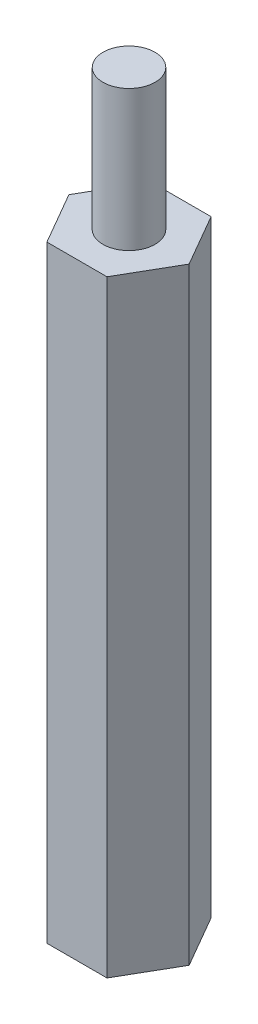
ISO-10303-21;
HEADER;
FILE_DESCRIPTION(('STEP AP214'),'2;1');
FILE_NAME('part.step','',(''),(''),'','','');
FILE_SCHEMA(('AUTOMOTIVE_DESIGN { 1 0 10303 214 1 1 1 1 }'));
ENDSEC;
DATA;
#1=APPLICATION_CONTEXT('core data for automotive mechanical design processes');
#2=APPLICATION_PROTOCOL_DEFINITION('international standard','automotive_design',2000,#1);
#3=PRODUCT_CONTEXT('',#1,'mechanical');
#4=PRODUCT('Part','Part','',(#3));
#5=PRODUCT_RELATED_PRODUCT_CATEGORY('part','',(#4));
#6=PRODUCT_DEFINITION_FORMATION('','',#4);
#7=PRODUCT_DEFINITION_CONTEXT('part definition',#1,'design');
#8=PRODUCT_DEFINITION('design','',#6,#7);
#9=PRODUCT_DEFINITION_SHAPE('','',#8);
#10=(LENGTH_UNIT() NAMED_UNIT(*) SI_UNIT(.MILLI.,.METRE.));
#11=(NAMED_UNIT(*) PLANE_ANGLE_UNIT() SI_UNIT($,.RADIAN.));
#12=(NAMED_UNIT(*) SI_UNIT($,.STERADIAN.) SOLID_ANGLE_UNIT());
#13=UNCERTAINTY_MEASURE_WITH_UNIT(LENGTH_MEASURE(1.E-05),#10,'distance_accuracy_value','');
#14=(GEOMETRIC_REPRESENTATION_CONTEXT(3) GLOBAL_UNCERTAINTY_ASSIGNED_CONTEXT((#13)) GLOBAL_UNIT_ASSIGNED_CONTEXT((#10,
#11,#12)) REPRESENTATION_CONTEXT('',''));
#15=CARTESIAN_POINT('',(0.,0.,0.));
#16=DIRECTION('',(0.,0.,1.));
#17=DIRECTION('',(1.,0.,0.));
#18=AXIS2_PLACEMENT_3D('',#15,#16,#17);
#19=CARTESIAN_POINT('',(-1.73205080756888,35.,-3.));
#20=DIRECTION('',(0.866025403784439,0.,0.5));
#21=DIRECTION('',(0.5,0.,-0.866025403784439));
#22=AXIS2_PLACEMENT_3D('',#19,#20,#21);
#23=PLANE('',#22);
#24=DIRECTION('',(-0.5,0.,0.866025403784439));
#25=VECTOR('',#24,1.);
#26=CARTESIAN_POINT('',(-1.73205080756888,0.,-3.));
#27=LINE('',#26,#25);
#28=CARTESIAN_POINT('',(-1.73205080756888,0.,-3.));
#29=VERTEX_POINT('',#28);
#30=CARTESIAN_POINT('',(-3.46410161513775,0.,0.));
#31=VERTEX_POINT('',#30);
#32=EDGE_CURVE('E134',#29,#31,#27,.T.);
#33=ORIENTED_EDGE('',*,*,#32,.T.);
#34=DIRECTION('',(0.,-1.,0.));
#35=VECTOR('',#34,1.);
#36=CARTESIAN_POINT('',(-3.46410161513775,35.,0.));
#37=LINE('',#36,#35);
#38=CARTESIAN_POINT('',(-3.46410161513775,35.,0.));
#39=VERTEX_POINT('',#38);
#40=EDGE_CURVE('E46',#39,#31,#37,.T.);
#41=ORIENTED_EDGE('',*,*,#40,.F.);
#42=DIRECTION('',(-0.5,0.,0.866025403784439));
#43=VECTOR('',#42,1.);
#44=CARTESIAN_POINT('',(-1.73205080756888,35.,-3.));
#45=LINE('',#44,#43);
#46=CARTESIAN_POINT('',(-1.73205080756888,35.,-3.));
#47=VERTEX_POINT('',#46);
#48=EDGE_CURVE('E151',#47,#39,#45,.T.);
#49=ORIENTED_EDGE('',*,*,#48,.F.);
#50=DIRECTION('',(0.,-1.,0.));
#51=VECTOR('',#50,1.);
#52=CARTESIAN_POINT('',(-1.73205080756888,35.,-3.));
#53=LINE('',#52,#51);
#54=EDGE_CURVE('E130',#47,#29,#53,.T.);
#55=ORIENTED_EDGE('',*,*,#54,.T.);
#56=EDGE_LOOP('',(#33,#41,#49,#55));
#57=FACE_BOUND('',#56,.T.);
#58=ADVANCED_FACE('F43',(#57),#23,.F.);
#59=CARTESIAN_POINT('',(-3.46410161513775,35.,0.));
#60=DIRECTION('',(0.866025403784439,0.,-0.5));
#61=DIRECTION('',(-0.5,0.,-0.866025403784439));
#62=AXIS2_PLACEMENT_3D('',#59,#60,#61);
#63=PLANE('',#62);
#64=DIRECTION('',(0.5,0.,0.866025403784439));
#65=VECTOR('',#64,1.);
#66=CARTESIAN_POINT('',(-3.46410161513775,0.,0.));
#67=LINE('',#66,#65);
#68=CARTESIAN_POINT('',(-1.73205080756888,0.,3.));
#69=VERTEX_POINT('',#68);
#70=EDGE_CURVE('E138',#31,#69,#67,.T.);
#71=ORIENTED_EDGE('',*,*,#70,.T.);
#72=DIRECTION('',(0.,-1.,0.));
#73=VECTOR('',#72,1.);
#74=CARTESIAN_POINT('',(-1.73205080756888,35.,3.));
#75=LINE('',#74,#73);
#76=CARTESIAN_POINT('',(-1.73205080756888,35.,3.));
#77=VERTEX_POINT('',#76);
#78=EDGE_CURVE('E157',#77,#69,#75,.T.);
#79=ORIENTED_EDGE('',*,*,#78,.F.);
#80=DIRECTION('',(0.5,0.,0.866025403784439));
#81=VECTOR('',#80,1.);
#82=CARTESIAN_POINT('',(-3.46410161513775,35.,0.));
#83=LINE('',#82,#81);
#84=EDGE_CURVE('E99',#39,#77,#83,.T.);
#85=ORIENTED_EDGE('',*,*,#84,.F.);
#86=ORIENTED_EDGE('',*,*,#40,.T.);
#87=EDGE_LOOP('',(#71,#79,#85,#86));
#88=FACE_BOUND('',#87,.T.);
#89=ADVANCED_FACE('F164',(#88),#63,.F.);
#90=CARTESIAN_POINT('',(-1.73205080756888,35.,3.));
#91=DIRECTION('',(0.,0.,-1.));
#92=DIRECTION('',(-1.,0.,0.));
#93=AXIS2_PLACEMENT_3D('',#90,#91,#92);
#94=PLANE('',#93);
#95=DIRECTION('',(1.,0.,0.));
#96=VECTOR('',#95,1.);
#97=CARTESIAN_POINT('',(-1.73205080756888,0.,3.));
#98=LINE('',#97,#96);
#99=CARTESIAN_POINT('',(1.73205080756888,0.,3.));
#100=VERTEX_POINT('',#99);
#101=EDGE_CURVE('E142',#69,#100,#98,.T.);
#102=ORIENTED_EDGE('',*,*,#101,.T.);
#103=DIRECTION('',(0.,-1.,0.));
#104=VECTOR('',#103,1.);
#105=CARTESIAN_POINT('',(1.73205080756888,35.,3.));
#106=LINE('',#105,#104);
#107=CARTESIAN_POINT('',(1.73205080756888,35.,3.));
#108=VERTEX_POINT('',#107);
#109=EDGE_CURVE('E123',#108,#100,#106,.T.);
#110=ORIENTED_EDGE('',*,*,#109,.F.);
#111=DIRECTION('',(1.,0.,0.));
#112=VECTOR('',#111,1.);
#113=CARTESIAN_POINT('',(-1.73205080756888,35.,3.));
#114=LINE('',#113,#112);
#115=EDGE_CURVE('E112',#77,#108,#114,.T.);
#116=ORIENTED_EDGE('',*,*,#115,.F.);
#117=ORIENTED_EDGE('',*,*,#78,.T.);
#118=EDGE_LOOP('',(#102,#110,#116,#117));
#119=FACE_BOUND('',#118,.T.);
#120=ADVANCED_FACE('F170',(#119),#94,.F.);
#121=CARTESIAN_POINT('',(1.73205080756888,35.,3.));
#122=DIRECTION('',(-0.866025403784439,0.,-0.5));
#123=DIRECTION('',(-0.5,0.,0.866025403784439));
#124=AXIS2_PLACEMENT_3D('',#121,#122,#123);
#125=PLANE('',#124);
#126=DIRECTION('',(0.5,0.,-0.866025403784439));
#127=VECTOR('',#126,1.);
#128=CARTESIAN_POINT('',(1.73205080756888,0.,3.));
#129=LINE('',#128,#127);
#130=CARTESIAN_POINT('',(3.46410161513775,0.,0.));
#131=VERTEX_POINT('',#130);
#132=EDGE_CURVE('E121',#100,#131,#129,.T.);
#133=ORIENTED_EDGE('',*,*,#132,.T.);
#134=DIRECTION('',(0.,-1.,0.));
#135=VECTOR('',#134,1.);
#136=CARTESIAN_POINT('',(3.46410161513775,35.,0.));
#137=LINE('',#136,#135);
#138=CARTESIAN_POINT('',(3.46410161513775,35.,0.));
#139=VERTEX_POINT('',#138);
#140=EDGE_CURVE('E118',#139,#131,#137,.T.);
#141=ORIENTED_EDGE('',*,*,#140,.F.);
#142=DIRECTION('',(0.5,0.,-0.866025403784439));
#143=VECTOR('',#142,1.);
#144=CARTESIAN_POINT('',(1.73205080756888,35.,3.));
#145=LINE('',#144,#143);
#146=EDGE_CURVE('E106',#108,#139,#145,.T.);
#147=ORIENTED_EDGE('',*,*,#146,.F.);
#148=ORIENTED_EDGE('',*,*,#109,.T.);
#149=EDGE_LOOP('',(#133,#141,#147,#148));
#150=FACE_BOUND('',#149,.T.);
#151=ADVANCED_FACE('F119',(#150),#125,.F.);
#152=CARTESIAN_POINT('',(3.46410161513775,35.,0.));
#153=DIRECTION('',(-0.866025403784439,0.,0.5));
#154=DIRECTION('',(0.5,0.,0.866025403784439));
#155=AXIS2_PLACEMENT_3D('',#152,#153,#154);
#156=PLANE('',#155);
#157=DIRECTION('',(-0.5,0.,-0.866025403784439));
#158=VECTOR('',#157,1.);
#159=CARTESIAN_POINT('',(3.46410161513775,0.,0.));
#160=LINE('',#159,#158);
#161=CARTESIAN_POINT('',(1.73205080756888,0.,-3.));
#162=VERTEX_POINT('',#161);
#163=EDGE_CURVE('E84',#131,#162,#160,.T.);
#164=ORIENTED_EDGE('',*,*,#163,.T.);
#165=DIRECTION('',(0.,-1.,0.));
#166=VECTOR('',#165,1.);
#167=CARTESIAN_POINT('',(1.73205080756888,35.,-3.));
#168=LINE('',#167,#166);
#169=CARTESIAN_POINT('',(1.73205080756888,35.,-3.));
#170=VERTEX_POINT('',#169);
#171=EDGE_CURVE('E124',#170,#162,#168,.T.);
#172=ORIENTED_EDGE('',*,*,#171,.F.);
#173=DIRECTION('',(-0.5,0.,-0.866025403784439));
#174=VECTOR('',#173,1.);
#175=CARTESIAN_POINT('',(3.46410161513775,35.,0.));
#176=LINE('',#175,#174);
#177=EDGE_CURVE('E110',#139,#170,#176,.T.);
#178=ORIENTED_EDGE('',*,*,#177,.F.);
#179=ORIENTED_EDGE('',*,*,#140,.T.);
#180=EDGE_LOOP('',(#164,#172,#178,#179));
#181=FACE_BOUND('',#180,.T.);
#182=ADVANCED_FACE('F126',(#181),#156,.F.);
#183=CARTESIAN_POINT('',(1.73205080756888,35.,-3.));
#184=DIRECTION('',(0.,0.,1.));
#185=DIRECTION('',(1.,0.,0.));
#186=AXIS2_PLACEMENT_3D('',#183,#184,#185);
#187=PLANE('',#186);
#188=DIRECTION('',(-1.,0.,0.));
#189=VECTOR('',#188,1.);
#190=CARTESIAN_POINT('',(1.73205080756888,0.,-3.));
#191=LINE('',#190,#189);
#192=EDGE_CURVE('E90',#162,#29,#191,.T.);
#193=ORIENTED_EDGE('',*,*,#192,.T.);
#194=ORIENTED_EDGE('',*,*,#54,.F.);
#195=DIRECTION('',(-1.,0.,0.));
#196=VECTOR('',#195,1.);
#197=CARTESIAN_POINT('',(1.73205080756888,35.,-3.));
#198=LINE('',#197,#196);
#199=EDGE_CURVE('E61',#170,#47,#198,.T.);
#200=ORIENTED_EDGE('',*,*,#199,.F.);
#201=ORIENTED_EDGE('',*,*,#171,.T.);
#202=EDGE_LOOP('',(#193,#194,#200,#201));
#203=FACE_BOUND('',#202,.T.);
#204=ADVANCED_FACE('F207',(#203),#187,.F.);
#205=CARTESIAN_POINT('',(0.,35.,0.));
#206=DIRECTION('',(0.,1.,0.));
#207=DIRECTION('',(0.,0.,1.));
#208=AXIS2_PLACEMENT_3D('',#205,#206,#207);
#209=PLANE('',#208);
#210=CARTESIAN_POINT('',(0.,35.,0.));
#211=DIRECTION('',(0.,1.,0.));
#212=DIRECTION('',(0.,0.,1.));
#213=AXIS2_PLACEMENT_3D('',#210,#211,#212);
#214=CIRCLE('',#213,1.5);
#215=CARTESIAN_POINT('',(0.,35.,1.5));
#216=VERTEX_POINT('',#215);
#217=EDGE_CURVE('E11',#216,#216,#214,.T.);
#218=ORIENTED_EDGE('',*,*,#217,.F.);
#219=EDGE_LOOP('',(#218));
#220=FACE_BOUND('',#219,.T.);
#221=ORIENTED_EDGE('',*,*,#48,.T.);
#222=ORIENTED_EDGE('',*,*,#84,.T.);
#223=ORIENTED_EDGE('',*,*,#115,.T.);
#224=ORIENTED_EDGE('',*,*,#146,.T.);
#225=ORIENTED_EDGE('',*,*,#177,.T.);
#226=ORIENTED_EDGE('',*,*,#199,.T.);
#227=EDGE_LOOP('',(#221,#222,#223,#224,#225,#226));
#228=FACE_BOUND('',#227,.T.);
#229=ADVANCED_FACE('F108',(#220,#228),#209,.T.);
#230=CARTESIAN_POINT('',(0.,0.,0.));
#231=DIRECTION('',(0.,1.,0.));
#232=DIRECTION('',(0.,0.,1.));
#233=AXIS2_PLACEMENT_3D('',#230,#231,#232);
#234=PLANE('',#233);
#235=CARTESIAN_POINT('',(0.,0.,0.));
#236=DIRECTION('',(0.,-1.,0.));
#237=DIRECTION('',(0.,0.,-1.));
#238=AXIS2_PLACEMENT_3D('',#235,#236,#237);
#239=CIRCLE('',#238,1.5);
#240=CARTESIAN_POINT('',(0.,0.,-1.5));
#241=VERTEX_POINT('',#240);
#242=EDGE_CURVE('E181',#241,#241,#239,.T.);
#243=ORIENTED_EDGE('',*,*,#242,.F.);
#244=EDGE_LOOP('',(#243));
#245=FACE_BOUND('',#244,.T.);
#246=ORIENTED_EDGE('',*,*,#32,.F.);
#247=ORIENTED_EDGE('',*,*,#192,.F.);
#248=ORIENTED_EDGE('',*,*,#163,.F.);
#249=ORIENTED_EDGE('',*,*,#132,.F.);
#250=ORIENTED_EDGE('',*,*,#101,.F.);
#251=ORIENTED_EDGE('',*,*,#70,.F.);
#252=EDGE_LOOP('',(#246,#247,#248,#249,#250,#251));
#253=FACE_BOUND('',#252,.T.);
#254=ADVANCED_FACE('F169',(#245,#253),#234,.F.);
#255=CARTESIAN_POINT('',(0.,43.0916054709663,0.));
#256=DIRECTION('',(0.,-1.,0.));
#257=DIRECTION('',(0.,0.,-1.));
#258=AXIS2_PLACEMENT_3D('',#255,#256,#257);
#259=CYLINDRICAL_SURFACE('',#258,1.5);
#260=CARTESIAN_POINT('',(0.,43.0916054709663,0.));
#261=DIRECTION('',(0.,1.,0.));
#262=DIRECTION('',(0.,0.,1.));
#263=AXIS2_PLACEMENT_3D('',#260,#261,#262);
#264=CIRCLE('',#263,1.5);
#265=CARTESIAN_POINT('',(0.,43.0916054709663,1.5));
#266=VERTEX_POINT('',#265);
#267=EDGE_CURVE('E139',#266,#266,#264,.T.);
#268=ORIENTED_EDGE('',*,*,#267,.F.);
#269=EDGE_LOOP('',(#268));
#270=FACE_BOUND('',#269,.T.);
#271=ORIENTED_EDGE('',*,*,#217,.T.);
#272=EDGE_LOOP('',(#271));
#273=FACE_BOUND('',#272,.T.);
#274=ADVANCED_FACE('F199',(#270,#273),#259,.T.);
#275=CARTESIAN_POINT('',(0.,43.0916054709663,0.));
#276=DIRECTION('',(0.,1.,0.));
#277=DIRECTION('',(0.,0.,1.));
#278=AXIS2_PLACEMENT_3D('',#275,#276,#277);
#279=PLANE('',#278);
#280=ORIENTED_EDGE('',*,*,#267,.T.);
#281=EDGE_LOOP('',(#280));
#282=FACE_BOUND('',#281,.T.);
#283=ADVANCED_FACE('F194',(#282),#279,.T.);
#284=CARTESIAN_POINT('',(0.,4.,0.));
#285=DIRECTION('',(0.,-1.,0.));
#286=DIRECTION('',(0.,0.,-1.));
#287=AXIS2_PLACEMENT_3D('',#284,#285,#286);
#288=CYLINDRICAL_SURFACE('',#287,1.5);
#289=CARTESIAN_POINT('',(0.,4.,0.));
#290=DIRECTION('',(0.,-1.,0.));
#291=DIRECTION('',(0.,0.,-1.));
#292=AXIS2_PLACEMENT_3D('',#289,#290,#291);
#293=CIRCLE('',#292,1.5);
#294=CARTESIAN_POINT('',(0.,4.,-1.5));
#295=VERTEX_POINT('',#294);
#296=EDGE_CURVE('E180',#295,#295,#293,.T.);
#297=ORIENTED_EDGE('',*,*,#296,.F.);
#298=EDGE_LOOP('',(#297));
#299=FACE_BOUND('',#298,.T.);
#300=ORIENTED_EDGE('',*,*,#242,.T.);
#301=EDGE_LOOP('',(#300));
#302=FACE_BOUND('',#301,.T.);
#303=ADVANCED_FACE('F191',(#299,#302),#288,.F.);
#304=CARTESIAN_POINT('',(0.,4.,0.));
#305=DIRECTION('',(0.,-1.,0.));
#306=DIRECTION('',(0.,0.,-1.));
#307=AXIS2_PLACEMENT_3D('',#304,#305,#306);
#308=PLANE('',#307);
#309=ORIENTED_EDGE('',*,*,#296,.T.);
#310=EDGE_LOOP('',(#309));
#311=FACE_BOUND('',#310,.T.);
#312=ADVANCED_FACE('F189',(#311),#308,.T.);
#313=CLOSED_SHELL('',(#58,#89,#120,#151,#182,#204,#229,#254,#274,#283,#303,#312));
#314=MANIFOLD_SOLID_BREP('B2',#313);
#315=ADVANCED_BREP_SHAPE_REPRESENTATION('',(#18,#314),#14);
#316=SHAPE_DEFINITION_REPRESENTATION(#9,#315);
ENDSEC;
END-ISO-10303-21;
